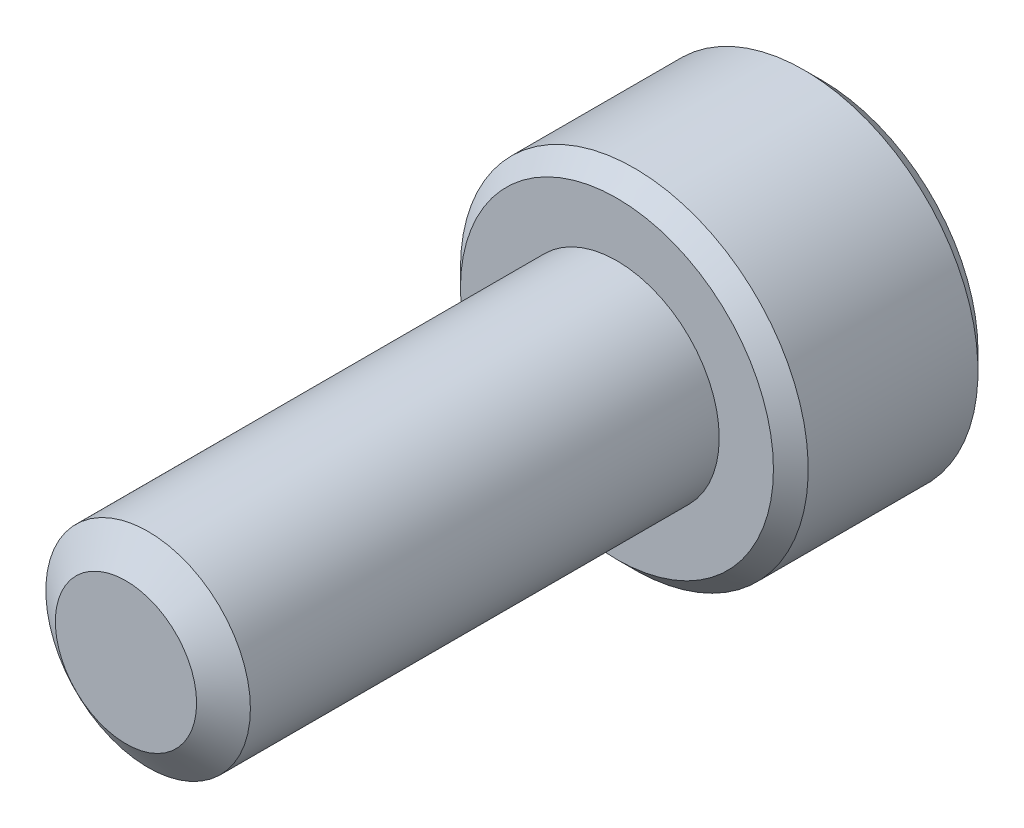
ISO-10303-21;
HEADER;
FILE_DESCRIPTION(('STEP AP214'),'2;1');
FILE_NAME('part.step','',(''),(''),'','','');
FILE_SCHEMA(('AUTOMOTIVE_DESIGN { 1 0 10303 214 1 1 1 1 }'));
ENDSEC;
DATA;
#1=APPLICATION_CONTEXT('core data for automotive mechanical design processes');
#2=APPLICATION_PROTOCOL_DEFINITION('international standard','automotive_design',2000,#1);
#3=PRODUCT_CONTEXT('',#1,'mechanical');
#4=PRODUCT('Part','Part','',(#3));
#5=PRODUCT_RELATED_PRODUCT_CATEGORY('part','',(#4));
#6=PRODUCT_DEFINITION_FORMATION('','',#4);
#7=PRODUCT_DEFINITION_CONTEXT('part definition',#1,'design');
#8=PRODUCT_DEFINITION('design','',#6,#7);
#9=PRODUCT_DEFINITION_SHAPE('','',#8);
#10=(LENGTH_UNIT() NAMED_UNIT(*) SI_UNIT(.MILLI.,.METRE.));
#11=(NAMED_UNIT(*) PLANE_ANGLE_UNIT() SI_UNIT($,.RADIAN.));
#12=(NAMED_UNIT(*) SI_UNIT($,.STERADIAN.) SOLID_ANGLE_UNIT());
#13=UNCERTAINTY_MEASURE_WITH_UNIT(LENGTH_MEASURE(1.E-05),#10,'distance_accuracy_value','');
#14=(GEOMETRIC_REPRESENTATION_CONTEXT(3) GLOBAL_UNCERTAINTY_ASSIGNED_CONTEXT((#13)) GLOBAL_UNIT_ASSIGNED_CONTEXT((#10,
#11,#12)) REPRESENTATION_CONTEXT('',''));
#15=CARTESIAN_POINT('',(0.,0.,0.));
#16=DIRECTION('',(0.,0.,1.));
#17=DIRECTION('',(1.,0.,0.));
#18=AXIS2_PLACEMENT_3D('',#15,#16,#17);
#19=CARTESIAN_POINT('',(0.,0.,-12.));
#20=DIRECTION('',(0.,0.,1.));
#21=DIRECTION('',(1.,0.,0.));
#22=AXIS2_PLACEMENT_3D('',#19,#20,#21);
#23=CYLINDRICAL_SURFACE('',#22,2.5);
#24=CARTESIAN_POINT('',(0.,0.,-12.));
#25=DIRECTION('',(0.,0.,-1.));
#26=DIRECTION('',(-1.,0.,0.));
#27=AXIS2_PLACEMENT_3D('',#24,#25,#26);
#28=CIRCLE('',#27,2.5);
#29=CARTESIAN_POINT('',(-2.5,0.,-12.));
#30=VERTEX_POINT('',#29);
#31=EDGE_CURVE('E216',#30,#30,#28,.F.);
#32=ORIENTED_EDGE('',*,*,#31,.T.);
#33=EDGE_LOOP('',(#32));
#34=FACE_BOUND('',#33,.T.);
#35=CARTESIAN_POINT('',(0.,0.,-0.541691224311848));
#36=DIRECTION('',(0.,0.,1.));
#37=DIRECTION('',(1.,0.,0.));
#38=AXIS2_PLACEMENT_3D('',#35,#36,#37);
#39=CIRCLE('',#38,2.5);
#40=CARTESIAN_POINT('',(2.5,0.,-0.541691224311848));
#41=VERTEX_POINT('',#40);
#42=EDGE_CURVE('E110',#41,#41,#39,.T.);
#43=ORIENTED_EDGE('',*,*,#42,.F.);
#44=EDGE_LOOP('',(#43));
#45=FACE_BOUND('',#44,.T.);
#46=ADVANCED_FACE('F36',(#34,#45),#23,.T.);
#47=CARTESIAN_POINT('',(0.,0.,0.));
#48=DIRECTION('',(0.,0.,-1.));
#49=DIRECTION('',(-1.,0.,0.));
#50=AXIS2_PLACEMENT_3D('',#47,#48,#49);
#51=CONICAL_SURFACE('',#50,1.72638475772933,0.959931088596884);
#52=ORIENTED_EDGE('',*,*,#42,.T.);
#53=EDGE_LOOP('',(#52));
#54=FACE_BOUND('',#53,.T.);
#55=CARTESIAN_POINT('',(0.,0.,0.));
#56=DIRECTION('',(0.,0.,1.));
#57=DIRECTION('',(1.,0.,0.));
#58=AXIS2_PLACEMENT_3D('',#55,#56,#57);
#59=CIRCLE('',#58,1.72638475772933);
#60=CARTESIAN_POINT('',(1.72638475772933,0.,0.));
#61=VERTEX_POINT('',#60);
#62=EDGE_CURVE('E214',#61,#61,#59,.T.);
#63=ORIENTED_EDGE('',*,*,#62,.F.);
#64=EDGE_LOOP('',(#63));
#65=FACE_BOUND('',#64,.T.);
#66=ADVANCED_FACE('F197',(#54,#65),#51,.T.);
#67=CARTESIAN_POINT('',(0.,0.,0.));
#68=DIRECTION('',(0.,0.,1.));
#69=DIRECTION('',(1.,0.,0.));
#70=AXIS2_PLACEMENT_3D('',#67,#68,#69);
#71=PLANE('',#70);
#72=ORIENTED_EDGE('',*,*,#62,.T.);
#73=EDGE_LOOP('',(#72));
#74=FACE_BOUND('',#73,.T.);
#75=ADVANCED_FACE('F194',(#74),#71,.T.);
#76=CARTESIAN_POINT('',(0.,0.,-17.));
#77=DIRECTION('',(0.,0.,1.));
#78=DIRECTION('',(1.,0.,0.));
#79=AXIS2_PLACEMENT_3D('',#76,#77,#78);
#80=CYLINDRICAL_SURFACE('',#79,4.25);
#81=CARTESIAN_POINT('',(0.,0.,-16.575));
#82=DIRECTION('',(0.,0.,-1.));
#83=DIRECTION('',(-1.,0.,0.));
#84=AXIS2_PLACEMENT_3D('',#81,#82,#83);
#85=CIRCLE('',#84,4.25);
#86=CARTESIAN_POINT('',(-4.25,0.,-16.575));
#87=VERTEX_POINT('',#86);
#88=EDGE_CURVE('E44',#87,#87,#85,.F.);
#89=ORIENTED_EDGE('',*,*,#88,.T.);
#90=EDGE_LOOP('',(#89));
#91=FACE_BOUND('',#90,.T.);
#92=CARTESIAN_POINT('',(0.,0.,-12.425));
#93=DIRECTION('',(0.,0.,-1.));
#94=DIRECTION('',(-1.,0.,0.));
#95=AXIS2_PLACEMENT_3D('',#92,#93,#94);
#96=CIRCLE('',#95,4.25);
#97=CARTESIAN_POINT('',(-4.25,0.,-12.425));
#98=VERTEX_POINT('',#97);
#99=EDGE_CURVE('E173',#98,#98,#96,.T.);
#100=ORIENTED_EDGE('',*,*,#99,.T.);
#101=EDGE_LOOP('',(#100));
#102=FACE_BOUND('',#101,.T.);
#103=ADVANCED_FACE('F178',(#91,#102),#80,.T.);
#104=CARTESIAN_POINT('',(0.,0.,-17.));
#105=DIRECTION('',(0.,0.,-1.));
#106=DIRECTION('',(-1.,0.,0.));
#107=AXIS2_PLACEMENT_3D('',#104,#105,#106);
#108=PLANE('',#107);
#109=CARTESIAN_POINT('',(0.,0.,-17.));
#110=DIRECTION('',(0.,0.,-1.));
#111=DIRECTION('',(-1.,0.,0.));
#112=AXIS2_PLACEMENT_3D('',#109,#110,#111);
#113=CIRCLE('',#112,3.825);
#114=CARTESIAN_POINT('',(-3.825,0.,-17.));
#115=VERTEX_POINT('',#114);
#116=EDGE_CURVE('E109',#115,#115,#113,.T.);
#117=ORIENTED_EDGE('',*,*,#116,.T.);
#118=EDGE_LOOP('',(#117));
#119=FACE_BOUND('',#118,.T.);
#120=CARTESIAN_POINT('',(0.,0.,-17.));
#121=DIRECTION('',(0.,0.,-1.));
#122=DIRECTION('',(-1.,0.,0.));
#123=AXIS2_PLACEMENT_3D('',#120,#121,#122);
#124=CIRCLE('',#123,2.3094010767585);
#125=CARTESIAN_POINT('',(-2.,1.15470053837925,-17.));
#126=VERTEX_POINT('',#125);
#127=CARTESIAN_POINT('',(0.,2.3094010767585,-17.));
#128=VERTEX_POINT('',#127);
#129=EDGE_CURVE('E90',#126,#128,#124,.T.);
#130=ORIENTED_EDGE('',*,*,#129,.F.);
#131=CARTESIAN_POINT('',(-2.,-1.15470053837925,-17.));
#132=VERTEX_POINT('',#131);
#133=EDGE_CURVE('E50',#132,#126,#124,.T.);
#134=ORIENTED_EDGE('',*,*,#133,.F.);
#135=CARTESIAN_POINT('',(0.,-2.3094010767585,-17.));
#136=VERTEX_POINT('',#135);
#137=EDGE_CURVE('E275',#136,#132,#124,.T.);
#138=ORIENTED_EDGE('',*,*,#137,.F.);
#139=CARTESIAN_POINT('',(2.,-1.15470053837925,-17.));
#140=VERTEX_POINT('',#139);
#141=EDGE_CURVE('E57',#140,#136,#124,.T.);
#142=ORIENTED_EDGE('',*,*,#141,.F.);
#143=CARTESIAN_POINT('',(2.,1.15470053837925,-17.));
#144=VERTEX_POINT('',#143);
#145=EDGE_CURVE('E131',#144,#140,#124,.T.);
#146=ORIENTED_EDGE('',*,*,#145,.F.);
#147=EDGE_CURVE('E99',#128,#144,#124,.T.);
#148=ORIENTED_EDGE('',*,*,#147,.F.);
#149=EDGE_LOOP('',(#130,#134,#138,#142,#146,#148));
#150=FACE_BOUND('',#149,.T.);
#151=ADVANCED_FACE('F130',(#119,#150),#108,.T.);
#152=CARTESIAN_POINT('',(0.,0.,-12.));
#153=DIRECTION('',(0.,0.,-1.));
#154=DIRECTION('',(-1.,0.,0.));
#155=AXIS2_PLACEMENT_3D('',#152,#153,#154);
#156=PLANE('',#155);
#157=CARTESIAN_POINT('',(0.,0.,-12.));
#158=DIRECTION('',(0.,0.,-1.));
#159=DIRECTION('',(-1.,0.,0.));
#160=AXIS2_PLACEMENT_3D('',#157,#158,#159);
#161=CIRCLE('',#160,3.825);
#162=CARTESIAN_POINT('',(-3.825,0.,-12.));
#163=VERTEX_POINT('',#162);
#164=EDGE_CURVE('E11',#163,#163,#161,.F.);
#165=ORIENTED_EDGE('',*,*,#164,.T.);
#166=EDGE_LOOP('',(#165));
#167=FACE_BOUND('',#166,.T.);
#168=ORIENTED_EDGE('',*,*,#31,.F.);
#169=EDGE_LOOP('',(#168));
#170=FACE_BOUND('',#169,.T.);
#171=ADVANCED_FACE('F187',(#167,#170),#156,.F.);
#172=CARTESIAN_POINT('',(0.,0.,-17.));
#173=DIRECTION('',(0.,0.,-1.));
#174=DIRECTION('',(-1.,0.,0.));
#175=AXIS2_PLACEMENT_3D('',#172,#173,#174);
#176=CONICAL_SURFACE('',#175,2.3094010767585,0.78539816339745);
#177=ORIENTED_EDGE('',*,*,#147,.T.);
#178=CARTESIAN_POINT('',(-0.000199999999999456,2.30951654681234,-17.0001154787137));
#179=CARTESIAN_POINT('',(0.0685530340307059,2.26982196410711,-16.9604530902256));
#180=CARTESIAN_POINT('',(0.138455742135512,2.22946361676572,-16.9231199822842));
#181=CARTESIAN_POINT('',(0.280995244550437,2.1471683966763,-16.8547636851361));
#182=CARTESIAN_POINT('',(0.353645597565359,2.10522369580642,-16.8237785337372));
#183=CARTESIAN_POINT('',(0.500141601053971,2.02064418875706,-16.7707002165441));
#184=CARTESIAN_POINT('',(0.573949935246294,1.97803092714269,-16.7484736271766));
#185=CARTESIAN_POINT('',(0.723191631835263,1.89186619344273,-16.7142288166751));
#186=CARTESIAN_POINT('',(0.798620433918151,1.84831735425552,-16.7021850291441));
#187=CARTESIAN_POINT('',(0.928615500671078,1.7732646674724,-16.6913185119056));
#188=CARTESIAN_POINT('',(0.983013783970107,1.74185780396625,-16.68970975361));
#189=CARTESIAN_POINT('',(1.09172145551969,1.67909540053412,-16.6924188775987));
#190=CARTESIAN_POINT('',(1.14603080592134,1.64773988246021,-16.696738837758));
#191=CARTESIAN_POINT('',(1.25413672758934,1.5853248994842,-16.7110595674099));
#192=CARTESIAN_POINT('',(1.30793265655479,1.55426580541469,-16.721066692762));
#193=CARTESIAN_POINT('',(1.41459426230557,1.49268469862228,-16.7462124302497));
#194=CARTESIAN_POINT('',(1.46746001007071,1.46216264491917,-16.7613506490422));
#195=CARTESIAN_POINT('',(1.60287973308984,1.38397803138049,-16.8062945034292));
#196=CARTESIAN_POINT('',(1.68459383484948,1.33680037273297,-16.8394888394258));
#197=CARTESIAN_POINT('',(1.8047470372578,1.26742988897853,-16.8955258231714));
#198=CARTESIAN_POINT('',(1.84434285210918,1.24456923461531,-16.9152147029469));
#199=CARTESIAN_POINT('',(1.92280095888787,1.19927142554652,-16.9563873183649));
#200=CARTESIAN_POINT('',(1.96166368359374,1.17683402097614,-16.9778699516512));
#201=CARTESIAN_POINT('',(2.0002,1.15458506832541,-17.0001154787137));
#202=B_SPLINE_CURVE_WITH_KNOTS('',3,(#178,#179,#180,#181,#182,#183,#184,#185,#186,#187,#188,
#189,#190,#191,#192,#193,#194,#195,#196,#197,#198,#199,#200,#201),.UNSPECIFIED.,.F.,.F.,(4,2,2,
2,2,2,2,2,2,2,2,4),(0.,0.266420613771063,0.534393751523387,0.798110374376912,1.06116288956936,
1.24939906803721,1.43770123566247,1.62621426093931,1.81471283831913,2.11415604834144,
2.2634717071779,2.41269626969771),.UNSPECIFIED.);
#203=EDGE_CURVE('E104',#128,#144,#202,.T.);
#204=ORIENTED_EDGE('',*,*,#203,.F.);
#205=EDGE_LOOP('',(#177,#204));
#206=FACE_BOUND('',#205,.T.);
#207=ADVANCED_FACE('F105',(#206),#176,.F.);
#208=ORIENTED_EDGE('',*,*,#145,.T.);
#209=CARTESIAN_POINT('',(2.,-2.30294417292924,-17.7407713550277));
#210=CARTESIAN_POINT('',(2.,-2.24687002663712,-17.698443273626));
#211=CARTESIAN_POINT('',(2.,-2.19048190536959,-17.6565251568643));
#212=CARTESIAN_POINT('',(2.,-2.07695390496424,-17.573690417861));
#213=CARTESIAN_POINT('',(2.,-2.01981384066454,-17.5327740496681));
#214=CARTESIAN_POINT('',(2.,-1.90424016804776,-17.4518334520186));
#215=CARTESIAN_POINT('',(2.,-1.8457999674391,-17.4118185915599));
#216=CARTESIAN_POINT('',(2.,-1.7279274546176,-17.3332889936643));
#217=CARTESIAN_POINT('',(2.,-1.66849521292324,-17.2947741502431));
#218=CARTESIAN_POINT('',(2.,-1.4816299571002,-17.1776406516043));
#219=CARTESIAN_POINT('',(2.,-1.35220318163536,-17.1021459017296));
#220=CARTESIAN_POINT('',(2.,-1.08689521592925,-16.9640493509944));
#221=CARTESIAN_POINT('',(2.,-0.951037763938191,-16.9014040859035));
#222=CARTESIAN_POINT('',(2.,-0.747111912259408,-16.8247635438751));
#223=CARTESIAN_POINT('',(2.,-0.682064034147875,-16.8027671799191));
#224=CARTESIAN_POINT('',(2.,-0.550398103294751,-16.7639966876601));
#225=CARTESIAN_POINT('',(2.,-0.483779942722474,-16.7472229191212));
#226=CARTESIAN_POINT('',(2.,-0.350484328847653,-16.7200482578844));
#227=CARTESIAN_POINT('',(2.,-0.283829489364784,-16.7095381767417));
#228=CARTESIAN_POINT('',(2.,-0.149806987139375,-16.6950960855449));
#229=CARTESIAN_POINT('',(2.,-0.0824394489341206,-16.6911629447331));
#230=CARTESIAN_POINT('',(2.,0.0499055622944907,-16.6901664769337));
#231=CARTESIAN_POINT('',(2.,0.114881285143173,-16.6928596448504));
#232=CARTESIAN_POINT('',(2.,0.244275921482761,-16.7044300704227));
#233=CARTESIAN_POINT('',(2.,0.308694780266753,-16.7133079288332));
#234=CARTESIAN_POINT('',(2.,0.437599788610704,-16.7369136592961));
#235=CARTESIAN_POINT('',(2.,0.502067428644594,-16.7517410834465));
#236=CARTESIAN_POINT('',(2.,0.629594322598306,-16.786457883628));
#237=CARTESIAN_POINT('',(2.,0.692653693883151,-16.8063468361063));
#238=CARTESIAN_POINT('',(2.,0.891187889210545,-16.8764469792562));
#239=CARTESIAN_POINT('',(2.,1.02383545707306,-16.9346418003215));
#240=CARTESIAN_POINT('',(2.,1.28290932150074,-17.0640305754596));
#241=CARTESIAN_POINT('',(2.,1.4093111258757,-17.1352712314148));
#242=CARTESIAN_POINT('',(2.,1.59200441438963,-17.2464419918747));
#243=CARTESIAN_POINT('',(2.,1.65027549026191,-17.2831821903374));
#244=CARTESIAN_POINT('',(2.,1.76581760389243,-17.3582145141838));
#245=CARTESIAN_POINT('',(2.,1.82308856543105,-17.396506757118));
#246=CARTESIAN_POINT('',(2.,1.93629654762084,-17.4740422640812));
#247=CARTESIAN_POINT('',(2.,1.99224062500539,-17.5132752761336));
#248=CARTESIAN_POINT('',(2.,2.103364240299,-17.5927788307365));
#249=CARTESIAN_POINT('',(2.,2.15854398422468,-17.6330490850006));
#250=CARTESIAN_POINT('',(2.,2.21340370692659,-17.6737442381459));
#251=B_SPLINE_CURVE_WITH_KNOTS('',3,(#209,#210,#211,#212,#213,#214,#215,#216,#217,#218,#219,
#220,#221,#222,#223,#224,#225,#226,#227,#228,#229,#230,#231,#232,#233,#234,#235,#236,#237,#238,
#239,#240,#241,#242,#243,#244,#245,#246,#247,#248,#249,#250),.UNSPECIFIED.,.F.,.F.,(4,2,2,2,2,2,
2,2,2,2,2,2,2,2,2,2,2,2,2,2,4),(0.,0.210772731976891,0.42159837465859,0.634057554623492,
0.846501695870172,1.29562155455624,1.74319622821646,1.94902062110208,2.15485918928326,
2.35699582502636,2.5590977043214,2.75388435553556,2.94868993014815,3.14690093452586,
3.34509535789702,3.77838155837654,4.21325029921625,4.41989056685647,4.62654651460921,
4.8315237711129,5.03644465914085),.UNSPECIFIED.);
#252=EDGE_CURVE('E98',#144,#140,#251,.F.);
#253=ORIENTED_EDGE('',*,*,#252,.F.);
#254=EDGE_LOOP('',(#208,#253));
#255=FACE_BOUND('',#254,.T.);
#256=ADVANCED_FACE('F281',(#255),#176,.F.);
#257=ORIENTED_EDGE('',*,*,#141,.T.);
#258=CARTESIAN_POINT('',(2.0002,-1.15458506832541,-17.0001154787137));
#259=CARTESIAN_POINT('',(1.93144696596929,-1.19427965103064,-16.9604530902256));
#260=CARTESIAN_POINT('',(1.86154425786449,-1.23463799837204,-16.9231199822842));
#261=CARTESIAN_POINT('',(1.71900475544956,-1.31693321846145,-16.8547636851361));
#262=CARTESIAN_POINT('',(1.64635440243464,-1.35887791933134,-16.8237785337372));
#263=CARTESIAN_POINT('',(1.49985839894603,-1.44345742638069,-16.7707002165441));
#264=CARTESIAN_POINT('',(1.42605006475371,-1.48607068799507,-16.7484736271766));
#265=CARTESIAN_POINT('',(1.27680836816474,-1.57223542169503,-16.7142288166751));
#266=CARTESIAN_POINT('',(1.20137956608185,-1.61578426088223,-16.7021850291441));
#267=CARTESIAN_POINT('',(1.07138449932892,-1.69083694766536,-16.6913185119056));
#268=CARTESIAN_POINT('',(1.01698621602989,-1.72224381117151,-16.68970975361));
#269=CARTESIAN_POINT('',(0.908278544480308,-1.78500621460364,-16.6924188775987));
#270=CARTESIAN_POINT('',(0.853969194078662,-1.81636173267754,-16.696738837758));
#271=CARTESIAN_POINT('',(0.745863272410663,-1.87877671565355,-16.7110595674099));
#272=CARTESIAN_POINT('',(0.69206734344521,-1.90983580972306,-16.721066692762));
#273=CARTESIAN_POINT('',(0.585405737694428,-1.97141691651547,-16.7462124302497));
#274=CARTESIAN_POINT('',(0.532539989929289,-2.00193897021859,-16.7613506490422));
#275=CARTESIAN_POINT('',(0.397120266910157,-2.08012358375727,-16.8062945034292));
#276=CARTESIAN_POINT('',(0.315406165150523,-2.12730124240478,-16.8394888394258));
#277=CARTESIAN_POINT('',(0.195252962742198,-2.19667172615922,-16.8955258231714));
#278=CARTESIAN_POINT('',(0.155657147890823,-2.21953238052245,-16.9152147029469));
#279=CARTESIAN_POINT('',(0.0771990411121271,-2.26483018959124,-16.9563873183649));
#280=CARTESIAN_POINT('',(0.0383363164062592,-2.28726759416161,-16.9778699516512));
#281=CARTESIAN_POINT('',(-0.000199999999999433,-2.30951654681234,-17.0001154787137));
#282=B_SPLINE_CURVE_WITH_KNOTS('',3,(#258,#259,#260,#261,#262,#263,#264,#265,#266,#267,#268,
#269,#270,#271,#272,#273,#274,#275,#276,#277,#278,#279,#280,#281),.UNSPECIFIED.,.F.,.F.,(4,2,2,
2,2,2,2,2,2,2,2,4),(0.,0.266420613771063,0.534393751523389,0.798110374376914,1.06116288956936,
1.24939906803722,1.43770123566247,1.62621426093931,1.81471283831913,2.11415604834145,
2.26347170717791,2.41269626969771),.UNSPECIFIED.);
#283=EDGE_CURVE('E141',#140,#136,#282,.T.);
#284=ORIENTED_EDGE('',*,*,#283,.F.);
#285=EDGE_LOOP('',(#257,#284));
#286=FACE_BOUND('',#285,.T.);
#287=ADVANCED_FACE('F278',(#286),#176,.F.);
#288=ORIENTED_EDGE('',*,*,#137,.T.);
#289=CARTESIAN_POINT('',(0.00020000000000056,-2.30951654681234,-17.0001154787137));
#290=CARTESIAN_POINT('',(-0.0685530340307053,-2.26982196410711,-16.9604530902256));
#291=CARTESIAN_POINT('',(-0.138455742135511,-2.22946361676572,-16.9231199822842));
#292=CARTESIAN_POINT('',(-0.280995244550436,-2.1471683966763,-16.8547636851361));
#293=CARTESIAN_POINT('',(-0.353645597565357,-2.10522369580642,-16.8237785337372));
#294=CARTESIAN_POINT('',(-0.50014160105397,-2.02064418875706,-16.7707002165441));
#295=CARTESIAN_POINT('',(-0.573949935246293,-1.97803092714269,-16.7484736271766));
#296=CARTESIAN_POINT('',(-0.723191631835262,-1.89186619344273,-16.7142288166751));
#297=CARTESIAN_POINT('',(-0.79862043391815,-1.84831735425552,-16.7021850291441));
#298=CARTESIAN_POINT('',(-0.928615500671077,-1.7732646674724,-16.6913185119056));
#299=CARTESIAN_POINT('',(-0.983013783970107,-1.74185780396625,-16.68970975361));
#300=CARTESIAN_POINT('',(-1.09172145551969,-1.67909540053412,-16.6924188775987));
#301=CARTESIAN_POINT('',(-1.14603080592134,-1.64773988246022,-16.696738837758));
#302=CARTESIAN_POINT('',(-1.25413672758934,-1.5853248994842,-16.7110595674099));
#303=CARTESIAN_POINT('',(-1.30793265655479,-1.55426580541469,-16.721066692762));
#304=CARTESIAN_POINT('',(-1.41459426230557,-1.49268469862228,-16.7462124302497));
#305=CARTESIAN_POINT('',(-1.46746001007071,-1.46216264491917,-16.7613506490422));
#306=CARTESIAN_POINT('',(-1.60287973308984,-1.38397803138049,-16.8062945034292));
#307=CARTESIAN_POINT('',(-1.68459383484948,-1.33680037273297,-16.8394888394258));
#308=CARTESIAN_POINT('',(-1.8047470372578,-1.26742988897853,-16.8955258231714));
#309=CARTESIAN_POINT('',(-1.84434285210918,-1.24456923461531,-16.9152147029469));
#310=CARTESIAN_POINT('',(-1.92280095888787,-1.19927142554652,-16.9563873183649));
#311=CARTESIAN_POINT('',(-1.96166368359374,-1.17683402097614,-16.9778699516512));
#312=CARTESIAN_POINT('',(-2.0002,-1.15458506832541,-17.0001154787137));
#313=B_SPLINE_CURVE_WITH_KNOTS('',3,(#289,#290,#291,#292,#293,#294,#295,#296,#297,#298,#299,
#300,#301,#302,#303,#304,#305,#306,#307,#308,#309,#310,#311,#312),.UNSPECIFIED.,.F.,.F.,(4,2,2,
2,2,2,2,2,2,2,2,4),(0.,0.266420613771064,0.534393751523388,0.798110374376913,1.06116288956936,
1.24939906803721,1.43770123566247,1.62621426093931,1.81471283831913,2.11415604834145,
2.26347170717791,2.41269626969771),.UNSPECIFIED.);
#314=EDGE_CURVE('E252',#136,#132,#313,.T.);
#315=ORIENTED_EDGE('',*,*,#314,.F.);
#316=EDGE_LOOP('',(#288,#315));
#317=FACE_BOUND('',#316,.T.);
#318=ADVANCED_FACE('F277',(#317),#176,.F.);
#319=ORIENTED_EDGE('',*,*,#133,.T.);
#320=CARTESIAN_POINT('',(-2.,-2.3029441732643,-17.7407713552807));
#321=CARTESIAN_POINT('',(-2.,-2.24687002696279,-17.6984432738692));
#322=CARTESIAN_POINT('',(-2.,-2.19048190568583,-17.6565251570978));
#323=CARTESIAN_POINT('',(-2.,-2.07695390526152,-17.5736904180751));
#324=CARTESIAN_POINT('',(-2.,-2.01981384095229,-17.5327740498725));
#325=CARTESIAN_POINT('',(-2.,-1.90424016831614,-17.4518334522036));
#326=CARTESIAN_POINT('',(-2.,-1.84579996769763,-17.4118185917352));
#327=CARTESIAN_POINT('',(-2.,-1.72792745485625,-17.3332889938203));
#328=CARTESIAN_POINT('',(-2.,-1.66849521315186,-17.2947741503895));
#329=CARTESIAN_POINT('',(-2.,-1.48162995729573,-17.1776406517203));
#330=CARTESIAN_POINT('',(-2.,-1.35220318180736,-17.1021459018253));
#331=CARTESIAN_POINT('',(-2.,-1.08689521605219,-16.9640493510523));
#332=CARTESIAN_POINT('',(-2.,-0.951037764035625,-16.901404085944));
#333=CARTESIAN_POINT('',(-2.,-0.747111912337647,-16.8247635439028));
#334=CARTESIAN_POINT('',(-2.,-0.682064034234152,-16.8027671799472));
#335=CARTESIAN_POINT('',(-2.,-0.550398103397368,-16.7639966876876));
#336=CARTESIAN_POINT('',(-2.,-0.483779942833393,-16.7472229191476));
#337=CARTESIAN_POINT('',(-2.,-0.3504843289749,-16.7200482579067));
#338=CARTESIAN_POINT('',(-2.,-0.283829489500055,-16.709538176761));
#339=CARTESIAN_POINT('',(-2.,-0.149806987290425,-16.6950960855565));
#340=CARTESIAN_POINT('',(-2.,-0.0824394490929249,-16.6911629447399));
#341=CARTESIAN_POINT('',(-2.,0.0499055621213781,-16.6901664769296));
#342=CARTESIAN_POINT('',(-2.,0.114881284963487,-16.6928596448403));
#343=CARTESIAN_POINT('',(-2.,0.244275921290586,-16.7044300703996));
#344=CARTESIAN_POINT('',(-2.,0.308694780068663,-16.7133079288031));
#345=CARTESIAN_POINT('',(-2.,0.437599788400936,-16.7369136592514));
#346=CARTESIAN_POINT('',(-2.,0.502067428429081,-16.7517410833941));
#347=CARTESIAN_POINT('',(-2.,0.629594322371857,-16.78645788356));
#348=CARTESIAN_POINT('',(-2.,0.69265369365151,-16.8063468360305));
#349=CARTESIAN_POINT('',(-2.,0.891187888928464,-16.8764469791434));
#350=CARTESIAN_POINT('',(-2.,1.02383545674826,-16.9346418001747));
#351=CARTESIAN_POINT('',(-2.,1.28290932109378,-17.0640305752409));
#352=CARTESIAN_POINT('',(-2.,1.40931112542932,-17.1352712311583));
#353=CARTESIAN_POINT('',(-2.,1.59200441388854,-17.2464419915627));
#354=CARTESIAN_POINT('',(-2.,1.65027548974481,-17.2831821900083));
#355=CARTESIAN_POINT('',(-2.,1.76581760334354,-17.3582145138205));
#356=CARTESIAN_POINT('',(-2.,1.82308856486638,-17.3965067567377));
#357=CARTESIAN_POINT('',(-2.,1.936296547025,-17.4740422636668));
#358=CARTESIAN_POINT('',(-2.,1.99224062439414,-17.5132752757022));
#359=CARTESIAN_POINT('',(-2.,2.10336423965705,-17.5927788302713));
#360=CARTESIAN_POINT('',(-2.,2.15854398356743,-17.6330490845185));
#361=CARTESIAN_POINT('',(-2.,2.21340370625406,-17.673744237647));
#362=B_SPLINE_CURVE_WITH_KNOTS('',3,(#320,#321,#322,#323,#324,#325,#326,#327,#328,#329,#330,
#331,#332,#333,#334,#335,#336,#337,#338,#339,#340,#341,#342,#343,#344,#345,#346,#347,#348,#349,
#350,#351,#352,#353,#354,#355,#356,#357,#358,#359,#360,#361),.UNSPECIFIED.,.F.,.F.,(4,2,2,2,2,2,
2,2,2,2,2,2,2,2,2,2,2,2,2,2,4),(0.,0.210772732017009,0.421598374738841,0.634057554744623,
0.846501696032183,1.29562155480994,1.74319622856097,1.94902062142334,2.15485918958132,
2.35699582530216,2.55909770457495,2.75388435576874,2.94868993036094,3.1469009347167,
3.34509535806592,3.77838155838771,4.21325029906866,4.41989056664097,4.62654651432579,
4.83152377076248,5.03644465872345),.UNSPECIFIED.);
#363=EDGE_CURVE('E120',#132,#126,#362,.T.);
#364=ORIENTED_EDGE('',*,*,#363,.F.);
#365=EDGE_LOOP('',(#319,#364));
#366=FACE_BOUND('',#365,.T.);
#367=ADVANCED_FACE('F290',(#366),#176,.F.);
#368=ORIENTED_EDGE('',*,*,#129,.T.);
#369=CARTESIAN_POINT('',(-2.0002,1.15458506832541,-17.0001154787137));
#370=CARTESIAN_POINT('',(-1.93144696596929,1.19427965103065,-16.9604530902256));
#371=CARTESIAN_POINT('',(-1.86154425786449,1.23463799837204,-16.9231199822842));
#372=CARTESIAN_POINT('',(-1.71900475544956,1.31693321846145,-16.8547636851361));
#373=CARTESIAN_POINT('',(-1.64635440243464,1.35887791933134,-16.8237785337372));
#374=CARTESIAN_POINT('',(-1.49985839894603,1.44345742638069,-16.7707002165441));
#375=CARTESIAN_POINT('',(-1.42605006475371,1.48607068799507,-16.7484736271766));
#376=CARTESIAN_POINT('',(-1.27680836816474,1.57223542169503,-16.7142288166751));
#377=CARTESIAN_POINT('',(-1.20137956608185,1.61578426088223,-16.7021850291441));
#378=CARTESIAN_POINT('',(-1.07138449932892,1.69083694766536,-16.6913185119056));
#379=CARTESIAN_POINT('',(-1.01698621602989,1.72224381117151,-16.68970975361));
#380=CARTESIAN_POINT('',(-0.908278544480308,1.78500621460364,-16.6924188775987));
#381=CARTESIAN_POINT('',(-0.853969194078662,1.81636173267754,-16.696738837758));
#382=CARTESIAN_POINT('',(-0.745863272410663,1.87877671565355,-16.7110595674099));
#383=CARTESIAN_POINT('',(-0.69206734344521,1.90983580972306,-16.721066692762));
#384=CARTESIAN_POINT('',(-0.585405737694428,1.97141691651547,-16.7462124302497));
#385=CARTESIAN_POINT('',(-0.532539989929289,2.00193897021859,-16.7613506490422));
#386=CARTESIAN_POINT('',(-0.397120266910157,2.08012358375727,-16.8062945034292));
#387=CARTESIAN_POINT('',(-0.315406165150521,2.12730124240478,-16.8394888394258));
#388=CARTESIAN_POINT('',(-0.195252962742198,2.19667172615922,-16.8955258231714));
#389=CARTESIAN_POINT('',(-0.155657147890824,2.21953238052245,-16.9152147029469));
#390=CARTESIAN_POINT('',(-0.0771990411121297,2.26483018959123,-16.9563873183649));
#391=CARTESIAN_POINT('',(-0.0383363164062612,2.28726759416161,-16.9778699516512));
#392=CARTESIAN_POINT('',(0.000199999999999579,2.30951654681234,-17.0001154787137));
#393=B_SPLINE_CURVE_WITH_KNOTS('',3,(#369,#370,#371,#372,#373,#374,#375,#376,#377,#378,#379,
#380,#381,#382,#383,#384,#385,#386,#387,#388,#389,#390,#391,#392),.UNSPECIFIED.,.F.,.F.,(4,2,2,
2,2,2,2,2,2,2,2,4),(0.,0.266420613771064,0.534393751523388,0.798110374376914,1.06116288956936,
1.24939906803722,1.43770123566247,1.62621426093931,1.81471283831913,2.11415604834145,
2.2634717071779,2.41269626969771),.UNSPECIFIED.);
#394=EDGE_CURVE('E94',#126,#128,#393,.T.);
#395=ORIENTED_EDGE('',*,*,#394,.F.);
#396=EDGE_LOOP('',(#368,#395));
#397=FACE_BOUND('',#396,.T.);
#398=ADVANCED_FACE('F92',(#397),#176,.F.);
#399=CARTESIAN_POINT('',(2.,3.46410161513775,-14.));
#400=DIRECTION('',(0.,0.,-1.));
#401=DIRECTION('',(-1.,0.,0.));
#402=AXIS2_PLACEMENT_3D('',#399,#400,#401);
#403=PLANE('',#402);
#404=DIRECTION('',(0.866025403784439,0.5,0.));
#405=VECTOR('',#404,1.);
#406=CARTESIAN_POINT('',(-2.,1.15470053837925,-14.));
#407=LINE('',#406,#405);
#408=CARTESIAN_POINT('',(-2.,1.15470053837925,-14.));
#409=VERTEX_POINT('',#408);
#410=CARTESIAN_POINT('',(0.,2.3094010767585,-14.));
#411=VERTEX_POINT('',#410);
#412=EDGE_CURVE('E119',#409,#411,#407,.T.);
#413=ORIENTED_EDGE('',*,*,#412,.T.);
#414=DIRECTION('',(0.866025403784439,-0.5,0.));
#415=VECTOR('',#414,1.);
#416=CARTESIAN_POINT('',(0.,2.3094010767585,-14.));
#417=LINE('',#416,#415);
#418=CARTESIAN_POINT('',(2.,1.15470053837925,-14.));
#419=VERTEX_POINT('',#418);
#420=EDGE_CURVE('E124',#411,#419,#417,.T.);
#421=ORIENTED_EDGE('',*,*,#420,.T.);
#422=DIRECTION('',(0.,-1.,0.));
#423=VECTOR('',#422,1.);
#424=CARTESIAN_POINT('',(2.,1.15470053837925,-14.));
#425=LINE('',#424,#423);
#426=CARTESIAN_POINT('',(2.,-1.15470053837925,-14.));
#427=VERTEX_POINT('',#426);
#428=EDGE_CURVE('E238',#419,#427,#425,.T.);
#429=ORIENTED_EDGE('',*,*,#428,.T.);
#430=DIRECTION('',(-0.866025403784439,-0.5,0.));
#431=VECTOR('',#430,1.);
#432=CARTESIAN_POINT('',(2.,-1.15470053837925,-14.));
#433=LINE('',#432,#431);
#434=CARTESIAN_POINT('',(0.,-2.3094010767585,-14.));
#435=VERTEX_POINT('',#434);
#436=EDGE_CURVE('E235',#427,#435,#433,.T.);
#437=ORIENTED_EDGE('',*,*,#436,.T.);
#438=DIRECTION('',(-0.866025403784439,0.5,0.));
#439=VECTOR('',#438,1.);
#440=CARTESIAN_POINT('',(0.,-2.3094010767585,-14.));
#441=LINE('',#440,#439);
#442=CARTESIAN_POINT('',(-2.,-1.15470053837925,-14.));
#443=VERTEX_POINT('',#442);
#444=EDGE_CURVE('E232',#435,#443,#441,.T.);
#445=ORIENTED_EDGE('',*,*,#444,.T.);
#446=DIRECTION('',(0.,1.,0.));
#447=VECTOR('',#446,1.);
#448=CARTESIAN_POINT('',(-2.,-1.15470053837925,-14.));
#449=LINE('',#448,#447);
#450=EDGE_CURVE('E127',#443,#409,#449,.T.);
#451=ORIENTED_EDGE('',*,*,#450,.T.);
#452=EDGE_LOOP('',(#413,#421,#429,#437,#445,#451));
#453=FACE_BOUND('',#452,.T.);
#454=ADVANCED_FACE('F161',(#453),#403,.T.);
#455=CARTESIAN_POINT('',(0.,2.3094010767585,-14.));
#456=DIRECTION('',(0.5,0.866025403784439,0.));
#457=DIRECTION('',(-0.866025403784439,0.5,0.));
#458=AXIS2_PLACEMENT_3D('',#455,#456,#457);
#459=PLANE('',#458);
#460=DIRECTION('',(0.,0.,-1.));
#461=VECTOR('',#460,1.);
#462=CARTESIAN_POINT('',(0.,2.3094010767585,-14.));
#463=LINE('',#462,#461);
#464=EDGE_CURVE('E116',#411,#128,#463,.T.);
#465=ORIENTED_EDGE('',*,*,#464,.T.);
#466=ORIENTED_EDGE('',*,*,#203,.T.);
#467=DIRECTION('',(0.,0.,-1.));
#468=VECTOR('',#467,1.);
#469=CARTESIAN_POINT('',(2.,1.15470053837925,-14.));
#470=LINE('',#469,#468);
#471=EDGE_CURVE('E126',#419,#144,#470,.T.);
#472=ORIENTED_EDGE('',*,*,#471,.F.);
#473=ORIENTED_EDGE('',*,*,#420,.F.);
#474=EDGE_LOOP('',(#465,#466,#472,#473));
#475=FACE_BOUND('',#474,.T.);
#476=ADVANCED_FACE('F122',(#475),#459,.F.);
#477=CARTESIAN_POINT('',(2.,1.15470053837925,-14.));
#478=DIRECTION('',(1.,0.,0.));
#479=DIRECTION('',(0.,0.,-1.));
#480=AXIS2_PLACEMENT_3D('',#477,#478,#479);
#481=PLANE('',#480);
#482=ORIENTED_EDGE('',*,*,#471,.T.);
#483=ORIENTED_EDGE('',*,*,#252,.T.);
#484=DIRECTION('',(0.,0.,-1.));
#485=VECTOR('',#484,1.);
#486=CARTESIAN_POINT('',(2.,-1.15470053837925,-14.));
#487=LINE('',#486,#485);
#488=EDGE_CURVE('E221',#427,#140,#487,.T.);
#489=ORIENTED_EDGE('',*,*,#488,.F.);
#490=ORIENTED_EDGE('',*,*,#428,.F.);
#491=EDGE_LOOP('',(#482,#483,#489,#490));
#492=FACE_BOUND('',#491,.T.);
#493=ADVANCED_FACE('F150',(#492),#481,.F.);
#494=CARTESIAN_POINT('',(2.,-1.15470053837925,-14.));
#495=DIRECTION('',(0.5,-0.866025403784439,0.));
#496=DIRECTION('',(0.866025403784439,0.5,0.));
#497=AXIS2_PLACEMENT_3D('',#494,#495,#496);
#498=PLANE('',#497);
#499=ORIENTED_EDGE('',*,*,#488,.T.);
#500=ORIENTED_EDGE('',*,*,#283,.T.);
#501=DIRECTION('',(0.,0.,-1.));
#502=VECTOR('',#501,1.);
#503=CARTESIAN_POINT('',(0.,-2.3094010767585,-14.));
#504=LINE('',#503,#502);
#505=EDGE_CURVE('E224',#435,#136,#504,.T.);
#506=ORIENTED_EDGE('',*,*,#505,.F.);
#507=ORIENTED_EDGE('',*,*,#436,.F.);
#508=EDGE_LOOP('',(#499,#500,#506,#507));
#509=FACE_BOUND('',#508,.T.);
#510=ADVANCED_FACE('F154',(#509),#498,.F.);
#511=CARTESIAN_POINT('',(0.,-2.3094010767585,-14.));
#512=DIRECTION('',(-0.5,-0.866025403784439,0.));
#513=DIRECTION('',(0.866025403784439,-0.5,0.));
#514=AXIS2_PLACEMENT_3D('',#511,#512,#513);
#515=PLANE('',#514);
#516=ORIENTED_EDGE('',*,*,#505,.T.);
#517=ORIENTED_EDGE('',*,*,#314,.T.);
#518=DIRECTION('',(0.,0.,-1.));
#519=VECTOR('',#518,1.);
#520=CARTESIAN_POINT('',(-2.,-1.15470053837925,-14.));
#521=LINE('',#520,#519);
#522=EDGE_CURVE('E227',#443,#132,#521,.T.);
#523=ORIENTED_EDGE('',*,*,#522,.F.);
#524=ORIENTED_EDGE('',*,*,#444,.F.);
#525=EDGE_LOOP('',(#516,#517,#523,#524));
#526=FACE_BOUND('',#525,.T.);
#527=ADVANCED_FACE('F260',(#526),#515,.F.);
#528=CARTESIAN_POINT('',(-2.,-1.15470053837925,-14.));
#529=DIRECTION('',(-1.,0.,0.));
#530=DIRECTION('',(0.,-1.,0.));
#531=AXIS2_PLACEMENT_3D('',#528,#529,#530);
#532=PLANE('',#531);
#533=ORIENTED_EDGE('',*,*,#522,.T.);
#534=ORIENTED_EDGE('',*,*,#363,.T.);
#535=DIRECTION('',(0.,0.,-1.));
#536=VECTOR('',#535,1.);
#537=CARTESIAN_POINT('',(-2.,1.15470053837925,-14.));
#538=LINE('',#537,#536);
#539=EDGE_CURVE('E118',#409,#126,#538,.T.);
#540=ORIENTED_EDGE('',*,*,#539,.F.);
#541=ORIENTED_EDGE('',*,*,#450,.F.);
#542=EDGE_LOOP('',(#533,#534,#540,#541));
#543=FACE_BOUND('',#542,.T.);
#544=ADVANCED_FACE('F257',(#543),#532,.F.);
#545=CARTESIAN_POINT('',(-2.,1.15470053837925,-14.));
#546=DIRECTION('',(-0.5,0.866025403784439,0.));
#547=DIRECTION('',(-0.866025403784439,-0.5,0.));
#548=AXIS2_PLACEMENT_3D('',#545,#546,#547);
#549=PLANE('',#548);
#550=ORIENTED_EDGE('',*,*,#539,.T.);
#551=ORIENTED_EDGE('',*,*,#394,.T.);
#552=ORIENTED_EDGE('',*,*,#464,.F.);
#553=ORIENTED_EDGE('',*,*,#412,.F.);
#554=EDGE_LOOP('',(#550,#551,#552,#553));
#555=FACE_BOUND('',#554,.T.);
#556=ADVANCED_FACE('F114',(#555),#549,.F.);
#557=CARTESIAN_POINT('',(0.,0.,-17.));
#558=DIRECTION('',(0.,0.,1.));
#559=DIRECTION('',(1.,0.,0.));
#560=AXIS2_PLACEMENT_3D('',#557,#558,#559);
#561=CONICAL_SURFACE('',#560,3.825,0.785398163397442);
#562=ORIENTED_EDGE('',*,*,#88,.F.);
#563=EDGE_LOOP('',(#562));
#564=FACE_BOUND('',#563,.T.);
#565=ORIENTED_EDGE('',*,*,#116,.F.);
#566=EDGE_LOOP('',(#565));
#567=FACE_BOUND('',#566,.T.);
#568=ADVANCED_FACE('F181',(#564,#567),#561,.T.);
#569=CARTESIAN_POINT('',(0.,0.,-12.425));
#570=DIRECTION('',(0.,0.,-1.));
#571=DIRECTION('',(-1.,0.,0.));
#572=AXIS2_PLACEMENT_3D('',#569,#570,#571);
#573=CONICAL_SURFACE('',#572,4.25,0.78539816339745);
#574=ORIENTED_EDGE('',*,*,#164,.F.);
#575=EDGE_LOOP('',(#574));
#576=FACE_BOUND('',#575,.T.);
#577=ORIENTED_EDGE('',*,*,#99,.F.);
#578=EDGE_LOOP('',(#577));
#579=FACE_BOUND('',#578,.T.);
#580=ADVANCED_FACE('F38',(#576,#579),#573,.T.);
#581=CLOSED_SHELL('',(#46,#66,#75,#103,#151,#171,#207,#256,#287,#318,#367,#398,#454,#476,#493,
#510,#527,#544,#556,#568,#580));
#582=MANIFOLD_SOLID_BREP('B2',#581);
#583=ADVANCED_BREP_SHAPE_REPRESENTATION('',(#18,#582),#14);
#584=SHAPE_DEFINITION_REPRESENTATION(#9,#583);
ENDSEC;
END-ISO-10303-21;
